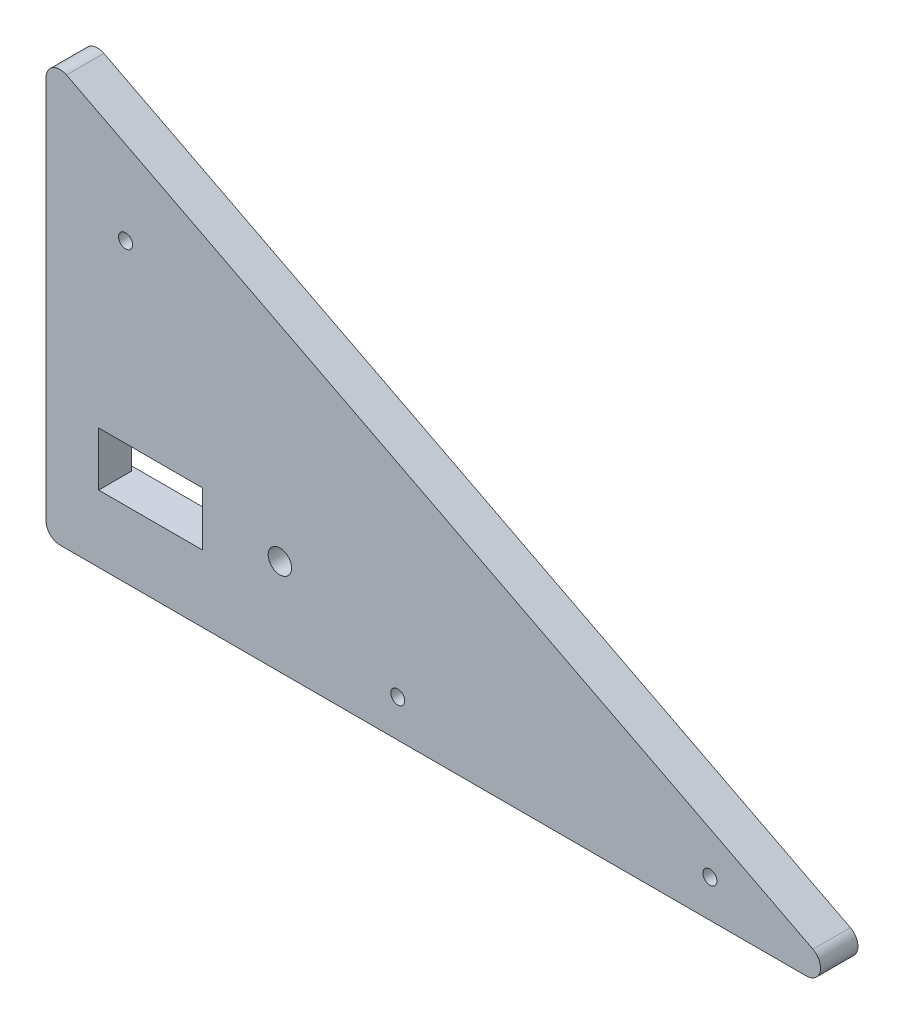
ISO-10303-21;
HEADER;
FILE_DESCRIPTION(('STEP AP214'),'2;1');
FILE_NAME('part.step','',(''),(''),'','','');
FILE_SCHEMA(('AUTOMOTIVE_DESIGN { 1 0 10303 214 1 1 1 1 }'));
ENDSEC;
DATA;
#1=APPLICATION_CONTEXT('core data for automotive mechanical design processes');
#2=APPLICATION_PROTOCOL_DEFINITION('international standard','automotive_design',2000,#1);
#3=PRODUCT_CONTEXT('',#1,'mechanical');
#4=PRODUCT('Part','Part','',(#3));
#5=PRODUCT_RELATED_PRODUCT_CATEGORY('part','',(#4));
#6=PRODUCT_DEFINITION_FORMATION('','',#4);
#7=PRODUCT_DEFINITION_CONTEXT('part definition',#1,'design');
#8=PRODUCT_DEFINITION('design','',#6,#7);
#9=PRODUCT_DEFINITION_SHAPE('','',#8);
#10=(LENGTH_UNIT() NAMED_UNIT(*) SI_UNIT(.MILLI.,.METRE.));
#11=(NAMED_UNIT(*) PLANE_ANGLE_UNIT() SI_UNIT($,.RADIAN.));
#12=(NAMED_UNIT(*) SI_UNIT($,.STERADIAN.) SOLID_ANGLE_UNIT());
#13=UNCERTAINTY_MEASURE_WITH_UNIT(LENGTH_MEASURE(1.E-05),#10,'distance_accuracy_value','');
#14=(GEOMETRIC_REPRESENTATION_CONTEXT(3) GLOBAL_UNCERTAINTY_ASSIGNED_CONTEXT((#13)) GLOBAL_UNIT_ASSIGNED_CONTEXT((#10,
#11,#12)) REPRESENTATION_CONTEXT('',''));
#15=CARTESIAN_POINT('',(0.,0.,0.));
#16=DIRECTION('',(0.,0.,1.));
#17=DIRECTION('',(1.,0.,0.));
#18=AXIS2_PLACEMENT_3D('',#15,#16,#17);
#19=CARTESIAN_POINT('',(-67.1521438450899,3.,0.));
#20=DIRECTION('',(0.,0.,-1.));
#21=DIRECTION('',(-1.,0.,0.));
#22=AXIS2_PLACEMENT_3D('',#19,#20,#21);
#23=PLANE('',#22);
#24=CARTESIAN_POINT('',(-20.1521438450899,20.5,0.));
#25=DIRECTION('',(0.,0.,-1.));
#26=DIRECTION('',(-1.,0.,0.));
#27=AXIS2_PLACEMENT_3D('',#24,#25,#26);
#28=CIRCLE('',#27,2.5);
#29=CARTESIAN_POINT('',(-22.6521438450899,20.5,0.));
#30=VERTEX_POINT('',#29);
#31=EDGE_CURVE('E434',#30,#30,#28,.T.);
#32=ORIENTED_EDGE('',*,*,#31,.F.);
#33=EDGE_LOOP('',(#32));
#34=FACE_BOUND('',#33,.T.);
#35=CARTESIAN_POINT('',(-53.1521438450899,63.3653891429603,0.));
#36=DIRECTION('',(0.,0.,-1.));
#37=DIRECTION('',(-1.,0.,0.));
#38=AXIS2_PLACEMENT_3D('',#35,#36,#37);
#39=CIRCLE('',#38,1.5);
#40=CARTESIAN_POINT('',(-54.6521438450899,63.3653891429603,0.));
#41=VERTEX_POINT('',#40);
#42=EDGE_CURVE('E170',#41,#41,#39,.T.);
#43=ORIENTED_EDGE('',*,*,#42,.F.);
#44=EDGE_LOOP('',(#43));
#45=FACE_BOUND('',#44,.T.);
#46=CARTESIAN_POINT('',(71.8001506845506,8.,0.));
#47=DIRECTION('',(0.,0.,-1.));
#48=DIRECTION('',(-1.,0.,0.));
#49=AXIS2_PLACEMENT_3D('',#46,#47,#48);
#50=CIRCLE('',#49,1.5);
#51=CARTESIAN_POINT('',(70.3001506845506,8.,0.));
#52=VERTEX_POINT('',#51);
#53=EDGE_CURVE('E235',#52,#52,#50,.F.);
#54=ORIENTED_EDGE('',*,*,#53,.T.);
#55=EDGE_LOOP('',(#54));
#56=FACE_BOUND('',#55,.T.);
#57=CARTESIAN_POINT('',(5.05015068455061,8.,0.));
#58=DIRECTION('',(0.,0.,-1.));
#59=DIRECTION('',(-1.,0.,0.));
#60=AXIS2_PLACEMENT_3D('',#57,#58,#59);
#61=CIRCLE('',#60,1.5);
#62=CARTESIAN_POINT('',(3.55015068455061,8.,0.));
#63=VERTEX_POINT('',#62);
#64=EDGE_CURVE('E222',#63,#63,#61,.F.);
#65=ORIENTED_EDGE('',*,*,#64,.T.);
#66=EDGE_LOOP('',(#65));
#67=FACE_BOUND('',#66,.T.);
#68=CARTESIAN_POINT('',(-67.1521438450899,3.,0.));
#69=DIRECTION('',(0.,0.,1.));
#70=DIRECTION('',(-1.,0.,0.));
#71=AXIS2_PLACEMENT_3D('',#68,#69,#70);
#72=CIRCLE('',#71,3.);
#73=CARTESIAN_POINT('',(-70.1521438450899,3.00000000000002,0.));
#74=VERTEX_POINT('',#73);
#75=CARTESIAN_POINT('',(-67.1521438450899,0.,0.));
#76=VERTEX_POINT('',#75);
#77=EDGE_CURVE('E240',#74,#76,#72,.T.);
#78=ORIENTED_EDGE('',*,*,#77,.F.);
#79=DIRECTION('',(0.,-1.,0.));
#80=VECTOR('',#79,1.);
#81=CARTESIAN_POINT('',(-70.1521438450899,85.083656802145,0.));
#82=LINE('',#81,#80);
#83=CARTESIAN_POINT('',(-70.1521438450899,85.083656802145,0.));
#84=VERTEX_POINT('',#83);
#85=EDGE_CURVE('E246',#84,#74,#82,.T.);
#86=ORIENTED_EDGE('',*,*,#85,.F.);
#87=CARTESIAN_POINT('',(-67.1521438450899,85.083656802145,0.));
#88=DIRECTION('',(0.,0.,1.));
#89=DIRECTION('',(1.,0.,0.));
#90=AXIS2_PLACEMENT_3D('',#87,#88,#89);
#91=CIRCLE('',#90,2.99999999999999);
#92=CARTESIAN_POINT('',(-65.7800998072276,87.7515202090994,0.));
#93=VERTEX_POINT('',#92);
#94=EDGE_CURVE('E274',#93,#84,#91,.T.);
#95=ORIENTED_EDGE('',*,*,#94,.F.);
#96=DIRECTION('',(-0.889287802318147,0.457348012620761,0.));
#97=VECTOR('',#96,1.);
#98=CARTESIAN_POINT('',(93.8270106413876,5.66786340695445,0.));
#99=LINE('',#98,#97);
#100=CARTESIAN_POINT('',(93.8270106413876,5.66786340695444,0.));
#101=VERTEX_POINT('',#100);
#102=EDGE_CURVE('E271',#101,#93,#99,.T.);
#103=ORIENTED_EDGE('',*,*,#102,.F.);
#104=CARTESIAN_POINT('',(92.4549666035253,3.,0.));
#105=DIRECTION('',(0.,0.,1.));
#106=DIRECTION('',(1.,0.,0.));
#107=AXIS2_PLACEMENT_3D('',#104,#105,#106);
#108=CIRCLE('',#107,3.);
#109=CARTESIAN_POINT('',(92.4549666035253,0.,0.));
#110=VERTEX_POINT('',#109);
#111=EDGE_CURVE('E268',#110,#101,#108,.T.);
#112=ORIENTED_EDGE('',*,*,#111,.F.);
#113=DIRECTION('',(1.,0.,0.));
#114=VECTOR('',#113,1.);
#115=CARTESIAN_POINT('',(-67.1521438450899,0.,0.));
#116=LINE('',#115,#114);
#117=EDGE_CURVE('E265',#76,#110,#116,.T.);
#118=ORIENTED_EDGE('',*,*,#117,.F.);
#119=EDGE_LOOP('',(#78,#86,#95,#103,#112,#118));
#120=FACE_BOUND('',#119,.T.);
#121=DIRECTION('',(0.,-1.,0.));
#122=VECTOR('',#121,1.);
#123=CARTESIAN_POINT('',(-63.9021438450899,0.,0.));
#124=LINE('',#123,#122);
#125=CARTESIAN_POINT('',(-63.9021438450899,25.8247747393751,0.));
#126=VERTEX_POINT('',#125);
#127=CARTESIAN_POINT('',(-63.9021438450899,14.324774739375,0.));
#128=VERTEX_POINT('',#127);
#129=EDGE_CURVE('E164',#126,#128,#124,.T.);
#130=ORIENTED_EDGE('',*,*,#129,.T.);
#131=DIRECTION('',(-1.,0.,0.));
#132=VECTOR('',#131,1.);
#133=CARTESIAN_POINT('',(-67.1521438450899,14.3247747393751,0.));
#134=LINE('',#133,#132);
#135=CARTESIAN_POINT('',(-31.7021438450898,14.324774739375,0.));
#136=VERTEX_POINT('',#135);
#137=EDGE_CURVE('E49',#136,#128,#134,.T.);
#138=ORIENTED_EDGE('',*,*,#137,.F.);
#139=DIRECTION('',(0.,-1.,0.));
#140=VECTOR('',#139,1.);
#141=CARTESIAN_POINT('',(-31.7021438450898,0.,0.));
#142=LINE('',#141,#140);
#143=CARTESIAN_POINT('',(-31.7021438450898,25.8247747393751,0.));
#144=VERTEX_POINT('',#143);
#145=EDGE_CURVE('E185',#144,#136,#142,.T.);
#146=ORIENTED_EDGE('',*,*,#145,.F.);
#147=DIRECTION('',(-1.,0.,0.));
#148=VECTOR('',#147,1.);
#149=CARTESIAN_POINT('',(-67.1521438450899,25.8247747393751,0.));
#150=LINE('',#149,#148);
#151=EDGE_CURVE('E12',#144,#126,#150,.T.);
#152=ORIENTED_EDGE('',*,*,#151,.T.);
#153=EDGE_LOOP('',(#130,#138,#146,#152));
#154=FACE_BOUND('',#153,.T.);
#155=ADVANCED_FACE('F40',(#34,#45,#56,#67,#120,#154),#23,.T.);
#156=CARTESIAN_POINT('',(-36.7021438450899,0.,-12.));
#157=DIRECTION('',(1.,0.,0.));
#158=DIRECTION('',(0.,0.,-1.));
#159=AXIS2_PLACEMENT_3D('',#156,#157,#158);
#160=PLANE('',#159);
#161=DIRECTION('',(0.,1.,0.));
#162=VECTOR('',#161,1.);
#163=CARTESIAN_POINT('',(-36.7021438450899,0.,1.));
#164=LINE('',#163,#162);
#165=CARTESIAN_POINT('',(-36.7021438450899,14.3247747393751,1.));
#166=VERTEX_POINT('',#165);
#167=CARTESIAN_POINT('',(-36.7021438450899,25.8247747393751,1.));
#168=VERTEX_POINT('',#167);
#169=EDGE_CURVE('E188',#166,#168,#164,.T.);
#170=ORIENTED_EDGE('',*,*,#169,.F.);
#171=DIRECTION('',(0.,0.,1.));
#172=VECTOR('',#171,1.);
#173=CARTESIAN_POINT('',(-36.7021438450899,14.3247747393751,-12.));
#174=LINE('',#173,#172);
#175=CARTESIAN_POINT('',(-36.7021438450899,14.3247747393751,8.));
#176=VERTEX_POINT('',#175);
#177=EDGE_CURVE('E223',#166,#176,#174,.T.);
#178=ORIENTED_EDGE('',*,*,#177,.T.);
#179=DIRECTION('',(0.,1.,0.));
#180=VECTOR('',#179,1.);
#181=CARTESIAN_POINT('',(-36.7021438450899,0.,8.));
#182=LINE('',#181,#180);
#183=CARTESIAN_POINT('',(-36.7021438450899,25.8247747393753,8.));
#184=VERTEX_POINT('',#183);
#185=EDGE_CURVE('E215',#176,#184,#182,.T.);
#186=ORIENTED_EDGE('',*,*,#185,.T.);
#187=DIRECTION('',(0.,0.,1.));
#188=VECTOR('',#187,1.);
#189=CARTESIAN_POINT('',(-36.7021438450899,25.8247747393753,-12.));
#190=LINE('',#189,#188);
#191=EDGE_CURVE('E219',#168,#184,#190,.T.);
#192=ORIENTED_EDGE('',*,*,#191,.F.);
#193=EDGE_LOOP('',(#170,#178,#186,#192));
#194=FACE_BOUND('',#193,.T.);
#195=ADVANCED_FACE('F333',(#194),#160,.F.);
#196=CARTESIAN_POINT('',(-58.9021438450899,0.,-12.));
#197=DIRECTION('',(1.,0.,0.));
#198=DIRECTION('',(0.,0.,-1.));
#199=AXIS2_PLACEMENT_3D('',#196,#197,#198);
#200=PLANE('',#199);
#201=DIRECTION('',(0.,0.,1.));
#202=VECTOR('',#201,1.);
#203=CARTESIAN_POINT('',(-58.9021438450899,14.324774739375,-12.));
#204=LINE('',#203,#202);
#205=CARTESIAN_POINT('',(-58.9021438450899,14.3247747393751,1.));
#206=VERTEX_POINT('',#205);
#207=CARTESIAN_POINT('',(-58.9021438450899,14.324774739375,8.));
#208=VERTEX_POINT('',#207);
#209=EDGE_CURVE('E226',#206,#208,#204,.T.);
#210=ORIENTED_EDGE('',*,*,#209,.F.);
#211=DIRECTION('',(0.,-1.,0.));
#212=VECTOR('',#211,1.);
#213=CARTESIAN_POINT('',(-58.9021438450899,0.,1.));
#214=LINE('',#213,#212);
#215=CARTESIAN_POINT('',(-58.9021438450899,25.8247747393751,1.));
#216=VERTEX_POINT('',#215);
#217=EDGE_CURVE('E159',#216,#206,#214,.T.);
#218=ORIENTED_EDGE('',*,*,#217,.F.);
#219=DIRECTION('',(0.,0.,1.));
#220=VECTOR('',#219,1.);
#221=CARTESIAN_POINT('',(-58.9021438450899,25.8247747393751,-12.));
#222=LINE('',#221,#220);
#223=CARTESIAN_POINT('',(-58.9021438450899,25.8247747393751,8.));
#224=VERTEX_POINT('',#223);
#225=EDGE_CURVE('E63',#216,#224,#222,.T.);
#226=ORIENTED_EDGE('',*,*,#225,.T.);
#227=DIRECTION('',(0.,1.,0.));
#228=VECTOR('',#227,1.);
#229=CARTESIAN_POINT('',(-58.9021438450899,0.,8.));
#230=LINE('',#229,#228);
#231=EDGE_CURVE('E207',#208,#224,#230,.T.);
#232=ORIENTED_EDGE('',*,*,#231,.F.);
#233=EDGE_LOOP('',(#210,#218,#226,#232));
#234=FACE_BOUND('',#233,.T.);
#235=ADVANCED_FACE('F323',(#234),#200,.T.);
#236=CARTESIAN_POINT('',(-67.1521438450899,3.,8.));
#237=DIRECTION('',(0.,0.,-1.));
#238=DIRECTION('',(-1.,0.,0.));
#239=AXIS2_PLACEMENT_3D('',#236,#237,#238);
#240=PLANE('',#239);
#241=CARTESIAN_POINT('',(-20.1521438450899,20.5,8.));
#242=DIRECTION('',(0.,0.,1.));
#243=DIRECTION('',(1.,0.,0.));
#244=AXIS2_PLACEMENT_3D('',#241,#242,#243);
#245=CIRCLE('',#244,2.5);
#246=CARTESIAN_POINT('',(-17.6521438450899,20.5,8.));
#247=VERTEX_POINT('',#246);
#248=EDGE_CURVE('E437',#247,#247,#245,.T.);
#249=ORIENTED_EDGE('',*,*,#248,.F.);
#250=EDGE_LOOP('',(#249));
#251=FACE_BOUND('',#250,.T.);
#252=CARTESIAN_POINT('',(-53.1521438450899,63.3653891429603,8.));
#253=DIRECTION('',(0.,0.,1.));
#254=DIRECTION('',(1.,0.,0.));
#255=AXIS2_PLACEMENT_3D('',#252,#253,#254);
#256=CIRCLE('',#255,1.5);
#257=CARTESIAN_POINT('',(-51.6521438450899,63.3653891429603,8.));
#258=VERTEX_POINT('',#257);
#259=EDGE_CURVE('E441',#258,#258,#256,.T.);
#260=ORIENTED_EDGE('',*,*,#259,.F.);
#261=EDGE_LOOP('',(#260));
#262=FACE_BOUND('',#261,.T.);
#263=CARTESIAN_POINT('',(-67.1521438450899,3.,8.));
#264=DIRECTION('',(0.,0.,1.));
#265=DIRECTION('',(-1.,0.,0.));
#266=AXIS2_PLACEMENT_3D('',#263,#264,#265);
#267=CIRCLE('',#266,3.);
#268=CARTESIAN_POINT('',(-70.1521438450899,3.00000000000002,8.));
#269=VERTEX_POINT('',#268);
#270=CARTESIAN_POINT('',(-67.1521438450899,0.,8.));
#271=VERTEX_POINT('',#270);
#272=EDGE_CURVE('E241',#269,#271,#267,.T.);
#273=ORIENTED_EDGE('',*,*,#272,.T.);
#274=DIRECTION('',(1.,0.,0.));
#275=VECTOR('',#274,1.);
#276=CARTESIAN_POINT('',(-67.1521438450899,0.,8.));
#277=LINE('',#276,#275);
#278=CARTESIAN_POINT('',(92.4549666035253,0.,8.));
#279=VERTEX_POINT('',#278);
#280=EDGE_CURVE('E245',#271,#279,#277,.T.);
#281=ORIENTED_EDGE('',*,*,#280,.T.);
#282=CARTESIAN_POINT('',(92.4549666035253,3.,8.));
#283=DIRECTION('',(0.,0.,1.));
#284=DIRECTION('',(1.,0.,0.));
#285=AXIS2_PLACEMENT_3D('',#282,#283,#284);
#286=CIRCLE('',#285,3.);
#287=CARTESIAN_POINT('',(93.8270106413876,5.66786340695444,8.));
#288=VERTEX_POINT('',#287);
#289=EDGE_CURVE('E249',#279,#288,#286,.T.);
#290=ORIENTED_EDGE('',*,*,#289,.T.);
#291=DIRECTION('',(-0.889287802318147,0.457348012620761,0.));
#292=VECTOR('',#291,1.);
#293=CARTESIAN_POINT('',(93.8270106413876,5.66786340695445,8.));
#294=LINE('',#293,#292);
#295=CARTESIAN_POINT('',(-65.7800998072276,87.7515202090994,8.));
#296=VERTEX_POINT('',#295);
#297=EDGE_CURVE('E252',#288,#296,#294,.T.);
#298=ORIENTED_EDGE('',*,*,#297,.T.);
#299=CARTESIAN_POINT('',(-67.1521438450899,85.083656802145,8.));
#300=DIRECTION('',(0.,0.,1.));
#301=DIRECTION('',(1.,0.,0.));
#302=AXIS2_PLACEMENT_3D('',#299,#300,#301);
#303=CIRCLE('',#302,2.99999999999999);
#304=CARTESIAN_POINT('',(-70.1521438450899,85.083656802145,8.));
#305=VERTEX_POINT('',#304);
#306=EDGE_CURVE('E255',#296,#305,#303,.T.);
#307=ORIENTED_EDGE('',*,*,#306,.T.);
#308=DIRECTION('',(0.,-1.,0.));
#309=VECTOR('',#308,1.);
#310=CARTESIAN_POINT('',(-70.1521438450899,85.083656802145,8.));
#311=LINE('',#310,#309);
#312=EDGE_CURVE('E258',#305,#269,#311,.T.);
#313=ORIENTED_EDGE('',*,*,#312,.T.);
#314=EDGE_LOOP('',(#273,#281,#290,#298,#307,#313));
#315=FACE_BOUND('',#314,.T.);
#316=CARTESIAN_POINT('',(5.05015068455061,8.,8.));
#317=DIRECTION('',(0.,0.,-1.));
#318=DIRECTION('',(-1.,0.,0.));
#319=AXIS2_PLACEMENT_3D('',#316,#317,#318);
#320=CIRCLE('',#319,1.5);
#321=CARTESIAN_POINT('',(3.55015068455061,8.,8.));
#322=VERTEX_POINT('',#321);
#323=EDGE_CURVE('E231',#322,#322,#320,.F.);
#324=ORIENTED_EDGE('',*,*,#323,.F.);
#325=EDGE_LOOP('',(#324));
#326=FACE_BOUND('',#325,.T.);
#327=CARTESIAN_POINT('',(71.8001506845506,8.,8.));
#328=DIRECTION('',(0.,0.,-1.));
#329=DIRECTION('',(-1.,0.,0.));
#330=AXIS2_PLACEMENT_3D('',#327,#328,#329);
#331=CIRCLE('',#330,1.5);
#332=CARTESIAN_POINT('',(70.3001506845506,8.,8.));
#333=VERTEX_POINT('',#332);
#334=EDGE_CURVE('E236',#333,#333,#331,.F.);
#335=ORIENTED_EDGE('',*,*,#334,.F.);
#336=EDGE_LOOP('',(#335));
#337=FACE_BOUND('',#336,.T.);
#338=DIRECTION('',(1.,0.,0.));
#339=VECTOR('',#338,1.);
#340=CARTESIAN_POINT('',(0.,25.8247747393751,8.));
#341=LINE('',#340,#339);
#342=EDGE_CURVE('E178',#224,#184,#341,.T.);
#343=ORIENTED_EDGE('',*,*,#342,.T.);
#344=ORIENTED_EDGE('',*,*,#185,.F.);
#345=DIRECTION('',(1.,0.,0.));
#346=VECTOR('',#345,1.);
#347=CARTESIAN_POINT('',(0.,14.3247747393751,8.));
#348=LINE('',#347,#346);
#349=EDGE_CURVE('E211',#208,#176,#348,.T.);
#350=ORIENTED_EDGE('',*,*,#349,.F.);
#351=ORIENTED_EDGE('',*,*,#231,.T.);
#352=EDGE_LOOP('',(#343,#344,#350,#351));
#353=FACE_BOUND('',#352,.T.);
#354=ADVANCED_FACE('F320',(#251,#262,#315,#326,#337,#353),#240,.F.);
#355=CARTESIAN_POINT('',(-67.1521438450899,3.,8.));
#356=DIRECTION('',(0.,0.,-1.));
#357=DIRECTION('',(-1.,0.,0.));
#358=AXIS2_PLACEMENT_3D('',#355,#356,#357);
#359=CYLINDRICAL_SURFACE('',#358,3.);
#360=ORIENTED_EDGE('',*,*,#77,.T.);
#361=DIRECTION('',(0.,0.,-1.));
#362=VECTOR('',#361,1.);
#363=CARTESIAN_POINT('',(-67.1521438450899,0.,8.));
#364=LINE('',#363,#362);
#365=EDGE_CURVE('E298',#271,#76,#364,.T.);
#366=ORIENTED_EDGE('',*,*,#365,.F.);
#367=ORIENTED_EDGE('',*,*,#272,.F.);
#368=DIRECTION('',(0.,0.,-1.));
#369=VECTOR('',#368,1.);
#370=CARTESIAN_POINT('',(-70.1521438450899,3.00000000000002,8.));
#371=LINE('',#370,#369);
#372=EDGE_CURVE('E261',#269,#74,#371,.T.);
#373=ORIENTED_EDGE('',*,*,#372,.T.);
#374=EDGE_LOOP('',(#360,#366,#367,#373));
#375=FACE_BOUND('',#374,.T.);
#376=ADVANCED_FACE('F42',(#375),#359,.T.);
#377=CARTESIAN_POINT('',(-67.1521438450899,0.,8.));
#378=DIRECTION('',(0.,1.,0.));
#379=DIRECTION('',(0.,0.,1.));
#380=AXIS2_PLACEMENT_3D('',#377,#378,#379);
#381=PLANE('',#380);
#382=ORIENTED_EDGE('',*,*,#117,.T.);
#383=DIRECTION('',(0.,0.,-1.));
#384=VECTOR('',#383,1.);
#385=CARTESIAN_POINT('',(92.4549666035253,0.,8.));
#386=LINE('',#385,#384);
#387=EDGE_CURVE('E294',#279,#110,#386,.T.);
#388=ORIENTED_EDGE('',*,*,#387,.F.);
#389=ORIENTED_EDGE('',*,*,#280,.F.);
#390=ORIENTED_EDGE('',*,*,#365,.T.);
#391=EDGE_LOOP('',(#382,#388,#389,#390));
#392=FACE_BOUND('',#391,.T.);
#393=ADVANCED_FACE('F369',(#392),#381,.F.);
#394=CARTESIAN_POINT('',(92.4549666035253,3.,8.));
#395=DIRECTION('',(0.,0.,-1.));
#396=DIRECTION('',(-1.,0.,0.));
#397=AXIS2_PLACEMENT_3D('',#394,#395,#396);
#398=CYLINDRICAL_SURFACE('',#397,3.);
#399=ORIENTED_EDGE('',*,*,#111,.T.);
#400=DIRECTION('',(0.,0.,-1.));
#401=VECTOR('',#400,1.);
#402=CARTESIAN_POINT('',(93.8270106413876,5.66786340695444,8.));
#403=LINE('',#402,#401);
#404=EDGE_CURVE('E290',#288,#101,#403,.T.);
#405=ORIENTED_EDGE('',*,*,#404,.F.);
#406=ORIENTED_EDGE('',*,*,#289,.F.);
#407=ORIENTED_EDGE('',*,*,#387,.T.);
#408=EDGE_LOOP('',(#399,#405,#406,#407));
#409=FACE_BOUND('',#408,.T.);
#410=ADVANCED_FACE('F366',(#409),#398,.T.);
#411=CARTESIAN_POINT('',(93.8270106413876,5.66786340695445,8.));
#412=DIRECTION('',(-0.457348012620761,-0.889287802318147,0.));
#413=DIRECTION('',(0.889287802318147,-0.457348012620761,0.));
#414=AXIS2_PLACEMENT_3D('',#411,#412,#413);
#415=PLANE('',#414);
#416=ORIENTED_EDGE('',*,*,#102,.T.);
#417=DIRECTION('',(0.,0.,-1.));
#418=VECTOR('',#417,1.);
#419=CARTESIAN_POINT('',(-65.7800998072276,87.7515202090994,8.));
#420=LINE('',#419,#418);
#421=EDGE_CURVE('E286',#296,#93,#420,.T.);
#422=ORIENTED_EDGE('',*,*,#421,.F.);
#423=ORIENTED_EDGE('',*,*,#297,.F.);
#424=ORIENTED_EDGE('',*,*,#404,.T.);
#425=EDGE_LOOP('',(#416,#422,#423,#424));
#426=FACE_BOUND('',#425,.T.);
#427=ADVANCED_FACE('F362',(#426),#415,.F.);
#428=CARTESIAN_POINT('',(-67.1521438450899,85.083656802145,8.));
#429=DIRECTION('',(0.,0.,-1.));
#430=DIRECTION('',(-1.,0.,0.));
#431=AXIS2_PLACEMENT_3D('',#428,#429,#430);
#432=CYLINDRICAL_SURFACE('',#431,2.99999999999999);
#433=ORIENTED_EDGE('',*,*,#94,.T.);
#434=DIRECTION('',(0.,0.,-1.));
#435=VECTOR('',#434,1.);
#436=CARTESIAN_POINT('',(-70.1521438450899,85.083656802145,8.));
#437=LINE('',#436,#435);
#438=EDGE_CURVE('E282',#305,#84,#437,.T.);
#439=ORIENTED_EDGE('',*,*,#438,.F.);
#440=ORIENTED_EDGE('',*,*,#306,.F.);
#441=ORIENTED_EDGE('',*,*,#421,.T.);
#442=EDGE_LOOP('',(#433,#439,#440,#441));
#443=FACE_BOUND('',#442,.T.);
#444=ADVANCED_FACE('F358',(#443),#432,.T.);
#445=CARTESIAN_POINT('',(-70.1521438450899,85.083656802145,8.));
#446=DIRECTION('',(1.,0.,0.));
#447=DIRECTION('',(0.,0.,-1.));
#448=AXIS2_PLACEMENT_3D('',#445,#446,#447);
#449=PLANE('',#448);
#450=ORIENTED_EDGE('',*,*,#85,.T.);
#451=ORIENTED_EDGE('',*,*,#372,.F.);
#452=ORIENTED_EDGE('',*,*,#312,.F.);
#453=ORIENTED_EDGE('',*,*,#438,.T.);
#454=EDGE_LOOP('',(#450,#451,#452,#453));
#455=FACE_BOUND('',#454,.T.);
#456=ADVANCED_FACE('F355',(#455),#449,.F.);
#457=CARTESIAN_POINT('',(5.05015068455061,8.,30.));
#458=DIRECTION('',(0.,0.,-1.));
#459=DIRECTION('',(-1.,0.,0.));
#460=AXIS2_PLACEMENT_3D('',#457,#458,#459);
#461=CYLINDRICAL_SURFACE('',#460,1.5);
#462=ORIENTED_EDGE('',*,*,#64,.F.);
#463=EDGE_LOOP('',(#462));
#464=FACE_BOUND('',#463,.T.);
#465=ORIENTED_EDGE('',*,*,#323,.T.);
#466=EDGE_LOOP('',(#465));
#467=FACE_BOUND('',#466,.T.);
#468=ADVANCED_FACE('F316',(#464,#467),#461,.F.);
#469=CARTESIAN_POINT('',(71.8001506845506,8.,30.));
#470=DIRECTION('',(0.,0.,-1.));
#471=DIRECTION('',(-1.,0.,0.));
#472=AXIS2_PLACEMENT_3D('',#469,#470,#471);
#473=CYLINDRICAL_SURFACE('',#472,1.5);
#474=ORIENTED_EDGE('',*,*,#53,.F.);
#475=EDGE_LOOP('',(#474));
#476=FACE_BOUND('',#475,.T.);
#477=ORIENTED_EDGE('',*,*,#334,.T.);
#478=EDGE_LOOP('',(#477));
#479=FACE_BOUND('',#478,.T.);
#480=ADVANCED_FACE('F312',(#476,#479),#473,.F.);
#481=CARTESIAN_POINT('',(0.,25.8247747393751,-12.));
#482=DIRECTION('',(0.,-1.,0.));
#483=DIRECTION('',(0.,0.,-1.));
#484=AXIS2_PLACEMENT_3D('',#481,#482,#483);
#485=PLANE('',#484);
#486=ORIENTED_EDGE('',*,*,#151,.F.);
#487=DIRECTION('',(0.,0.,-1.));
#488=VECTOR('',#487,1.);
#489=CARTESIAN_POINT('',(-31.7021438450898,25.8247747393751,1.));
#490=LINE('',#489,#488);
#491=CARTESIAN_POINT('',(-31.7021438450898,25.8247747393751,1.));
#492=VERTEX_POINT('',#491);
#493=EDGE_CURVE('E167',#492,#144,#490,.T.);
#494=ORIENTED_EDGE('',*,*,#493,.F.);
#495=DIRECTION('',(1.,0.,0.));
#496=VECTOR('',#495,1.);
#497=CARTESIAN_POINT('',(0.,25.824774739375,1.));
#498=LINE('',#497,#496);
#499=EDGE_CURVE('E191',#168,#492,#498,.T.);
#500=ORIENTED_EDGE('',*,*,#499,.F.);
#501=ORIENTED_EDGE('',*,*,#191,.T.);
#502=ORIENTED_EDGE('',*,*,#342,.F.);
#503=ORIENTED_EDGE('',*,*,#225,.F.);
#504=DIRECTION('',(-1.,0.,0.));
#505=VECTOR('',#504,1.);
#506=CARTESIAN_POINT('',(0.,25.8247747393751,1.));
#507=LINE('',#506,#505);
#508=CARTESIAN_POINT('',(-63.9021438450899,25.8247747393751,1.));
#509=VERTEX_POINT('',#508);
#510=EDGE_CURVE('E56',#216,#509,#507,.T.);
#511=ORIENTED_EDGE('',*,*,#510,.T.);
#512=DIRECTION('',(0.,0.,-1.));
#513=VECTOR('',#512,1.);
#514=CARTESIAN_POINT('',(-63.9021438450899,25.8247747393751,1.));
#515=LINE('',#514,#513);
#516=EDGE_CURVE('E150',#509,#126,#515,.T.);
#517=ORIENTED_EDGE('',*,*,#516,.T.);
#518=EDGE_LOOP('',(#486,#494,#500,#501,#502,#503,#511,#517));
#519=FACE_BOUND('',#518,.T.);
#520=ADVANCED_FACE('F315',(#519),#485,.T.);
#521=CARTESIAN_POINT('',(0.,14.3247747393751,-12.));
#522=DIRECTION('',(0.,-1.,0.));
#523=DIRECTION('',(0.,0.,-1.));
#524=AXIS2_PLACEMENT_3D('',#521,#522,#523);
#525=PLANE('',#524);
#526=ORIENTED_EDGE('',*,*,#137,.T.);
#527=DIRECTION('',(0.,0.,-1.));
#528=VECTOR('',#527,1.);
#529=CARTESIAN_POINT('',(-63.9021438450899,14.324774739375,1.));
#530=LINE('',#529,#528);
#531=CARTESIAN_POINT('',(-63.9021438450899,14.324774739375,1.));
#532=VERTEX_POINT('',#531);
#533=EDGE_CURVE('E147',#532,#128,#530,.T.);
#534=ORIENTED_EDGE('',*,*,#533,.F.);
#535=DIRECTION('',(1.,0.,0.));
#536=VECTOR('',#535,1.);
#537=CARTESIAN_POINT('',(0.,14.324774739375,1.));
#538=LINE('',#537,#536);
#539=EDGE_CURVE('E153',#532,#206,#538,.T.);
#540=ORIENTED_EDGE('',*,*,#539,.T.);
#541=ORIENTED_EDGE('',*,*,#209,.T.);
#542=ORIENTED_EDGE('',*,*,#349,.T.);
#543=ORIENTED_EDGE('',*,*,#177,.F.);
#544=DIRECTION('',(-1.,0.,0.));
#545=VECTOR('',#544,1.);
#546=CARTESIAN_POINT('',(0.,14.324774739375,1.));
#547=LINE('',#546,#545);
#548=CARTESIAN_POINT('',(-31.7021438450898,14.324774739375,1.));
#549=VERTEX_POINT('',#548);
#550=EDGE_CURVE('E184',#549,#166,#547,.T.);
#551=ORIENTED_EDGE('',*,*,#550,.F.);
#552=DIRECTION('',(0.,0.,-1.));
#553=VECTOR('',#552,1.);
#554=CARTESIAN_POINT('',(-31.7021438450898,14.324774739375,1.));
#555=LINE('',#554,#553);
#556=EDGE_CURVE('E195',#549,#136,#555,.T.);
#557=ORIENTED_EDGE('',*,*,#556,.T.);
#558=EDGE_LOOP('',(#526,#534,#540,#541,#542,#543,#551,#557));
#559=FACE_BOUND('',#558,.T.);
#560=ADVANCED_FACE('F156',(#559),#525,.F.);
#561=CARTESIAN_POINT('',(-63.9021438450899,0.,1.));
#562=DIRECTION('',(1.,0.,0.));
#563=DIRECTION('',(0.,0.,-1.));
#564=AXIS2_PLACEMENT_3D('',#561,#562,#563);
#565=PLANE('',#564);
#566=ORIENTED_EDGE('',*,*,#129,.F.);
#567=ORIENTED_EDGE('',*,*,#516,.F.);
#568=DIRECTION('',(0.,-1.,0.));
#569=VECTOR('',#568,1.);
#570=CARTESIAN_POINT('',(-63.9021438450899,0.,1.));
#571=LINE('',#570,#569);
#572=EDGE_CURVE('E143',#509,#532,#571,.T.);
#573=ORIENTED_EDGE('',*,*,#572,.T.);
#574=ORIENTED_EDGE('',*,*,#533,.T.);
#575=EDGE_LOOP('',(#566,#567,#573,#574));
#576=FACE_BOUND('',#575,.T.);
#577=ADVANCED_FACE('F146',(#576),#565,.T.);
#578=CARTESIAN_POINT('',(0.,0.,1.));
#579=DIRECTION('',(0.,0.,-1.));
#580=DIRECTION('',(-1.,0.,0.));
#581=AXIS2_PLACEMENT_3D('',#578,#579,#580);
#582=PLANE('',#581);
#583=ORIENTED_EDGE('',*,*,#539,.F.);
#584=ORIENTED_EDGE('',*,*,#572,.F.);
#585=ORIENTED_EDGE('',*,*,#510,.F.);
#586=ORIENTED_EDGE('',*,*,#217,.T.);
#587=EDGE_LOOP('',(#583,#584,#585,#586));
#588=FACE_BOUND('',#587,.T.);
#589=ADVANCED_FACE('F161',(#588),#582,.T.);
#590=CARTESIAN_POINT('',(-31.7021438450898,0.,1.));
#591=DIRECTION('',(1.,0.,0.));
#592=DIRECTION('',(0.,0.,-1.));
#593=AXIS2_PLACEMENT_3D('',#590,#591,#592);
#594=PLANE('',#593);
#595=ORIENTED_EDGE('',*,*,#145,.T.);
#596=ORIENTED_EDGE('',*,*,#556,.F.);
#597=DIRECTION('',(0.,-1.,0.));
#598=VECTOR('',#597,1.);
#599=CARTESIAN_POINT('',(-31.7021438450898,0.,1.));
#600=LINE('',#599,#598);
#601=EDGE_CURVE('E180',#492,#549,#600,.T.);
#602=ORIENTED_EDGE('',*,*,#601,.F.);
#603=ORIENTED_EDGE('',*,*,#493,.T.);
#604=EDGE_LOOP('',(#595,#596,#602,#603));
#605=FACE_BOUND('',#604,.T.);
#606=ADVANCED_FACE('F413',(#605),#594,.F.);
#607=CARTESIAN_POINT('',(0.,0.,1.));
#608=DIRECTION('',(0.,0.,-1.));
#609=DIRECTION('',(-1.,0.,0.));
#610=AXIS2_PLACEMENT_3D('',#607,#608,#609);
#611=PLANE('',#610);
#612=ORIENTED_EDGE('',*,*,#601,.T.);
#613=ORIENTED_EDGE('',*,*,#550,.T.);
#614=ORIENTED_EDGE('',*,*,#169,.T.);
#615=ORIENTED_EDGE('',*,*,#499,.T.);
#616=EDGE_LOOP('',(#612,#613,#614,#615));
#617=FACE_BOUND('',#616,.T.);
#618=ADVANCED_FACE('F416',(#617),#611,.T.);
#619=CARTESIAN_POINT('',(-53.1521438450899,63.3653891429603,-2.));
#620=DIRECTION('',(0.,0.,1.));
#621=DIRECTION('',(1.,0.,0.));
#622=AXIS2_PLACEMENT_3D('',#619,#620,#621);
#623=CYLINDRICAL_SURFACE('',#622,1.5);
#624=ORIENTED_EDGE('',*,*,#42,.T.);
#625=EDGE_LOOP('',(#624));
#626=FACE_BOUND('',#625,.T.);
#627=ORIENTED_EDGE('',*,*,#259,.T.);
#628=EDGE_LOOP('',(#627));
#629=FACE_BOUND('',#628,.T.);
#630=ADVANCED_FACE('F419',(#626,#629),#623,.F.);
#631=CARTESIAN_POINT('',(-20.1521438450899,20.5,-12.));
#632=DIRECTION('',(0.,0.,1.));
#633=DIRECTION('',(1.,0.,0.));
#634=AXIS2_PLACEMENT_3D('',#631,#632,#633);
#635=CYLINDRICAL_SURFACE('',#634,2.5);
#636=ORIENTED_EDGE('',*,*,#31,.T.);
#637=EDGE_LOOP('',(#636));
#638=FACE_BOUND('',#637,.T.);
#639=ORIENTED_EDGE('',*,*,#248,.T.);
#640=EDGE_LOOP('',(#639));
#641=FACE_BOUND('',#640,.T.);
#642=ADVANCED_FACE('F426',(#638,#641),#635,.F.);
#643=CLOSED_SHELL('',(#155,#195,#235,#354,#376,#393,#410,#427,#444,#456,#468,#480,#520,#560,
#577,#589,#606,#618,#630,#642));
#644=MANIFOLD_SOLID_BREP('B2',#643);
#645=ADVANCED_BREP_SHAPE_REPRESENTATION('',(#18,#644),#14);
#646=SHAPE_DEFINITION_REPRESENTATION(#9,#645);
ENDSEC;
END-ISO-10303-21;
